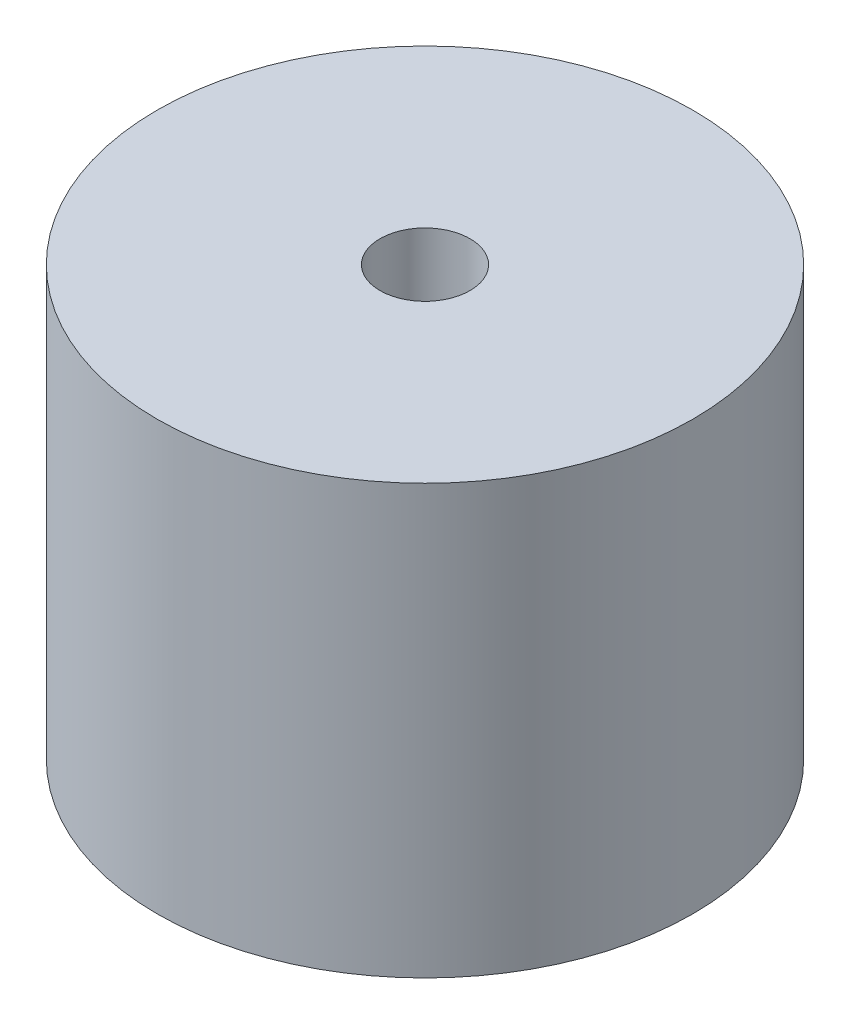
ISO-10303-21;
HEADER;
FILE_DESCRIPTION(('STEP AP214'),'2;1');
FILE_NAME('part.step','',(''),(''),'','','');
FILE_SCHEMA(('AUTOMOTIVE_DESIGN { 1 0 10303 214 1 1 1 1 }'));
ENDSEC;
DATA;
#1=APPLICATION_CONTEXT('core data for automotive mechanical design processes');
#2=APPLICATION_PROTOCOL_DEFINITION('international standard','automotive_design',2000,#1);
#3=PRODUCT_CONTEXT('',#1,'mechanical');
#4=PRODUCT('Part','Part','',(#3));
#5=PRODUCT_RELATED_PRODUCT_CATEGORY('part','',(#4));
#6=PRODUCT_DEFINITION_FORMATION('','',#4);
#7=PRODUCT_DEFINITION_CONTEXT('part definition',#1,'design');
#8=PRODUCT_DEFINITION('design','',#6,#7);
#9=PRODUCT_DEFINITION_SHAPE('','',#8);
#10=(LENGTH_UNIT() NAMED_UNIT(*) SI_UNIT(.MILLI.,.METRE.));
#11=(NAMED_UNIT(*) PLANE_ANGLE_UNIT() SI_UNIT($,.RADIAN.));
#12=(NAMED_UNIT(*) SI_UNIT($,.STERADIAN.) SOLID_ANGLE_UNIT());
#13=UNCERTAINTY_MEASURE_WITH_UNIT(LENGTH_MEASURE(1.E-05),#10,'distance_accuracy_value','');
#14=(GEOMETRIC_REPRESENTATION_CONTEXT(3) GLOBAL_UNCERTAINTY_ASSIGNED_CONTEXT((#13)) GLOBAL_UNIT_ASSIGNED_CONTEXT((#10,
#11,#12)) REPRESENTATION_CONTEXT('',''));
#15=CARTESIAN_POINT('',(0.,0.,0.));
#16=DIRECTION('',(0.,0.,1.));
#17=DIRECTION('',(1.,0.,0.));
#18=AXIS2_PLACEMENT_3D('',#15,#16,#17);
#19=CARTESIAN_POINT('',(0.,20.,0.));
#20=DIRECTION('',(0.,-1.,0.));
#21=DIRECTION('',(0.,0.,-1.));
#22=AXIS2_PLACEMENT_3D('',#19,#20,#21);
#23=CYLINDRICAL_SURFACE('',#22,12.5);
#24=CARTESIAN_POINT('',(0.,20.,0.));
#25=DIRECTION('',(0.,1.,0.));
#26=DIRECTION('',(0.,0.,1.));
#27=AXIS2_PLACEMENT_3D('',#24,#25,#26);
#28=CIRCLE('',#27,12.5);
#29=CARTESIAN_POINT('',(0.,20.,12.5));
#30=VERTEX_POINT('',#29);
#31=EDGE_CURVE('E10',#30,#30,#28,.T.);
#32=ORIENTED_EDGE('',*,*,#31,.F.);
#33=EDGE_LOOP('',(#32));
#34=FACE_BOUND('',#33,.T.);
#35=CARTESIAN_POINT('',(0.,0.,0.));
#36=DIRECTION('',(0.,1.,0.));
#37=DIRECTION('',(0.,0.,1.));
#38=AXIS2_PLACEMENT_3D('',#35,#36,#37);
#39=CIRCLE('',#38,12.5);
#40=CARTESIAN_POINT('',(0.,0.,12.5));
#41=VERTEX_POINT('',#40);
#42=EDGE_CURVE('E36',#41,#41,#39,.T.);
#43=ORIENTED_EDGE('',*,*,#42,.T.);
#44=EDGE_LOOP('',(#43));
#45=FACE_BOUND('',#44,.T.);
#46=ADVANCED_FACE('F33',(#34,#45),#23,.T.);
#47=CARTESIAN_POINT('',(0.,20.,0.));
#48=DIRECTION('',(0.,1.,0.));
#49=DIRECTION('',(0.,0.,1.));
#50=AXIS2_PLACEMENT_3D('',#47,#48,#49);
#51=PLANE('',#50);
#52=CARTESIAN_POINT('',(0.,20.,0.));
#53=DIRECTION('',(0.,1.,0.));
#54=DIRECTION('',(0.,0.,1.));
#55=AXIS2_PLACEMENT_3D('',#52,#53,#54);
#56=CIRCLE('',#55,2.1);
#57=CARTESIAN_POINT('',(0.,20.,2.1));
#58=VERTEX_POINT('',#57);
#59=EDGE_CURVE('E57',#58,#58,#56,.T.);
#60=ORIENTED_EDGE('',*,*,#59,.F.);
#61=EDGE_LOOP('',(#60));
#62=FACE_BOUND('',#61,.T.);
#63=ORIENTED_EDGE('',*,*,#31,.T.);
#64=EDGE_LOOP('',(#63));
#65=FACE_BOUND('',#64,.T.);
#66=ADVANCED_FACE('F72',(#62,#65),#51,.T.);
#67=CARTESIAN_POINT('',(0.,0.,0.));
#68=DIRECTION('',(0.,1.,0.));
#69=DIRECTION('',(0.,0.,1.));
#70=AXIS2_PLACEMENT_3D('',#67,#68,#69);
#71=PLANE('',#70);
#72=CARTESIAN_POINT('',(0.,0.,0.));
#73=DIRECTION('',(0.,-1.,0.));
#74=DIRECTION('',(0.,0.,-1.));
#75=AXIS2_PLACEMENT_3D('',#72,#73,#74);
#76=CIRCLE('',#75,10.5);
#77=CARTESIAN_POINT('',(0.,0.,-10.5));
#78=VERTEX_POINT('',#77);
#79=EDGE_CURVE('E45',#78,#78,#76,.T.);
#80=ORIENTED_EDGE('',*,*,#79,.F.);
#81=EDGE_LOOP('',(#80));
#82=FACE_BOUND('',#81,.T.);
#83=ORIENTED_EDGE('',*,*,#42,.F.);
#84=EDGE_LOOP('',(#83));
#85=FACE_BOUND('',#84,.T.);
#86=ADVANCED_FACE('F74',(#82,#85),#71,.F.);
#87=CARTESIAN_POINT('',(0.,1.,0.));
#88=DIRECTION('',(0.,-1.,0.));
#89=DIRECTION('',(0.,0.,-1.));
#90=AXIS2_PLACEMENT_3D('',#87,#88,#89);
#91=CYLINDRICAL_SURFACE('',#90,10.5);
#92=CARTESIAN_POINT('',(0.,1.,0.));
#93=DIRECTION('',(0.,-1.,0.));
#94=DIRECTION('',(0.,0.,-1.));
#95=AXIS2_PLACEMENT_3D('',#92,#93,#94);
#96=CIRCLE('',#95,10.5);
#97=CARTESIAN_POINT('',(0.,1.,-10.5));
#98=VERTEX_POINT('',#97);
#99=EDGE_CURVE('E43',#98,#98,#96,.T.);
#100=ORIENTED_EDGE('',*,*,#99,.F.);
#101=EDGE_LOOP('',(#100));
#102=FACE_BOUND('',#101,.T.);
#103=ORIENTED_EDGE('',*,*,#79,.T.);
#104=EDGE_LOOP('',(#103));
#105=FACE_BOUND('',#104,.T.);
#106=ADVANCED_FACE('F80',(#102,#105),#91,.F.);
#107=CARTESIAN_POINT('',(0.,1.,0.));
#108=DIRECTION('',(0.,-1.,0.));
#109=DIRECTION('',(0.,0.,-1.));
#110=AXIS2_PLACEMENT_3D('',#107,#108,#109);
#111=PLANE('',#110);
#112=CARTESIAN_POINT('',(0.,1.,0.));
#113=DIRECTION('',(0.,-1.,0.));
#114=DIRECTION('',(0.,0.,-1.));
#115=AXIS2_PLACEMENT_3D('',#112,#113,#114);
#116=CIRCLE('',#115,6.);
#117=CARTESIAN_POINT('',(0.,1.,-6.));
#118=VERTEX_POINT('',#117);
#119=EDGE_CURVE('E48',#118,#118,#116,.T.);
#120=ORIENTED_EDGE('',*,*,#119,.F.);
#121=EDGE_LOOP('',(#120));
#122=FACE_BOUND('',#121,.T.);
#123=ORIENTED_EDGE('',*,*,#99,.T.);
#124=EDGE_LOOP('',(#123));
#125=FACE_BOUND('',#124,.T.);
#126=ADVANCED_FACE('F86',(#122,#125),#111,.T.);
#127=CARTESIAN_POINT('',(0.,1.,0.));
#128=DIRECTION('',(0.,-1.,0.));
#129=DIRECTION('',(0.,0.,-1.));
#130=AXIS2_PLACEMENT_3D('',#127,#128,#129);
#131=CYLINDRICAL_SURFACE('',#130,6.);
#132=ORIENTED_EDGE('',*,*,#119,.T.);
#133=EDGE_LOOP('',(#132));
#134=FACE_BOUND('',#133,.T.);
#135=CARTESIAN_POINT('',(0.,0.,0.));
#136=DIRECTION('',(0.,-1.,0.));
#137=DIRECTION('',(0.,0.,-1.));
#138=AXIS2_PLACEMENT_3D('',#135,#136,#137);
#139=CIRCLE('',#138,6.);
#140=CARTESIAN_POINT('',(0.,0.,-6.));
#141=VERTEX_POINT('',#140);
#142=EDGE_CURVE('E51',#141,#141,#139,.T.);
#143=ORIENTED_EDGE('',*,*,#142,.F.);
#144=EDGE_LOOP('',(#143));
#145=FACE_BOUND('',#144,.T.);
#146=ADVANCED_FACE('F90',(#134,#145),#131,.T.);
#147=ORIENTED_EDGE('',*,*,#142,.T.);
#148=EDGE_LOOP('',(#147));
#149=FACE_BOUND('',#148,.T.);
#150=ADVANCED_FACE('F68',(#149),#71,.F.);
#151=CARTESIAN_POINT('',(0.,10.,0.));
#152=DIRECTION('',(0.,1.,0.));
#153=DIRECTION('',(0.,0.,1.));
#154=AXIS2_PLACEMENT_3D('',#151,#152,#153);
#155=CYLINDRICAL_SURFACE('',#154,2.1);
#156=CARTESIAN_POINT('',(0.,10.,0.));
#157=DIRECTION('',(0.,1.,0.));
#158=DIRECTION('',(0.,0.,1.));
#159=AXIS2_PLACEMENT_3D('',#156,#157,#158);
#160=CIRCLE('',#159,2.1);
#161=CARTESIAN_POINT('',(0.,10.,2.1));
#162=VERTEX_POINT('',#161);
#163=EDGE_CURVE('E54',#162,#162,#160,.T.);
#164=ORIENTED_EDGE('',*,*,#163,.F.);
#165=EDGE_LOOP('',(#164));
#166=FACE_BOUND('',#165,.T.);
#167=ORIENTED_EDGE('',*,*,#59,.T.);
#168=EDGE_LOOP('',(#167));
#169=FACE_BOUND('',#168,.T.);
#170=ADVANCED_FACE('F65',(#166,#169),#155,.F.);
#171=CARTESIAN_POINT('',(0.,10.,0.));
#172=DIRECTION('',(0.,1.,0.));
#173=DIRECTION('',(0.,0.,1.));
#174=AXIS2_PLACEMENT_3D('',#171,#172,#173);
#175=PLANE('',#174);
#176=ORIENTED_EDGE('',*,*,#163,.T.);
#177=EDGE_LOOP('',(#176));
#178=FACE_BOUND('',#177,.T.);
#179=ADVANCED_FACE('F63',(#178),#175,.T.);
#180=CLOSED_SHELL('',(#46,#66,#86,#106,#126,#146,#150,#170,#179));
#181=MANIFOLD_SOLID_BREP('B2',#180);
#182=ADVANCED_BREP_SHAPE_REPRESENTATION('',(#18,#181),#14);
#183=SHAPE_DEFINITION_REPRESENTATION(#9,#182);
ENDSEC;
END-ISO-10303-21;
